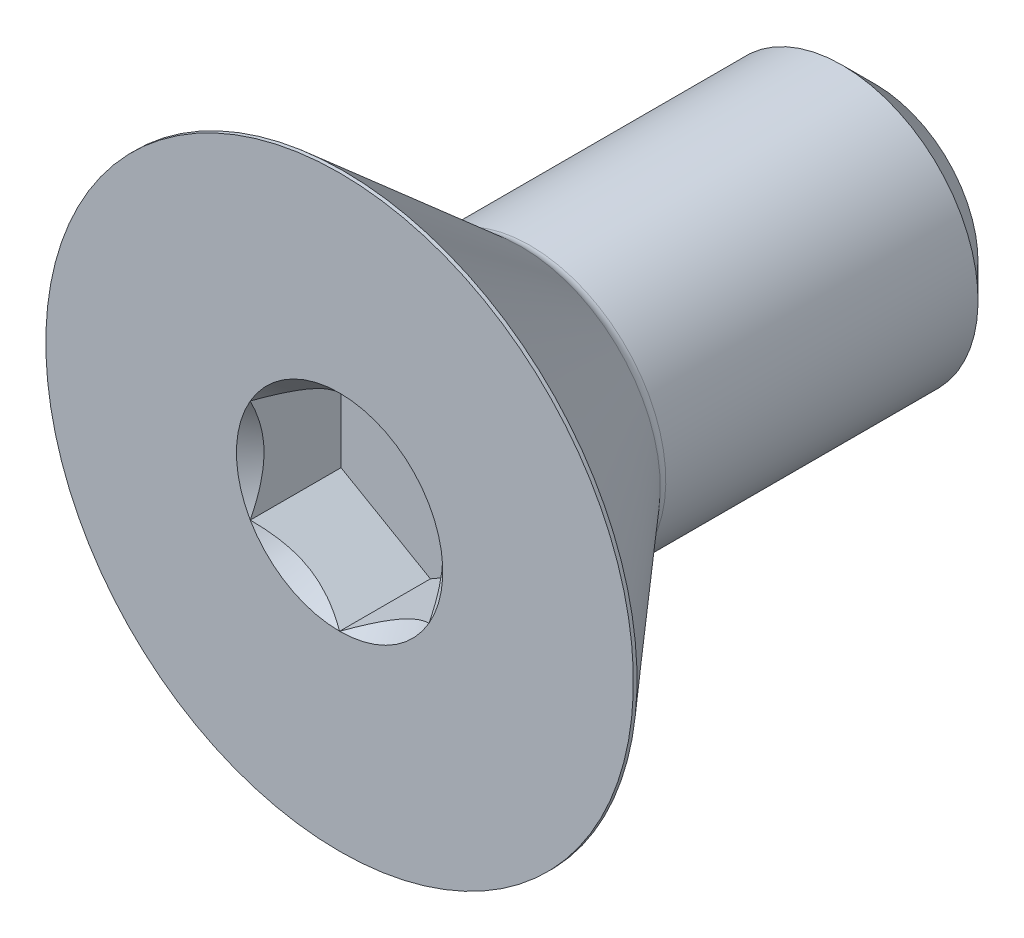
ISO-10303-21;
HEADER;
FILE_DESCRIPTION(('STEP AP214'),'2;1');
FILE_NAME('part.step','',(''),(''),'','','');
FILE_SCHEMA(('AUTOMOTIVE_DESIGN { 1 0 10303 214 1 1 1 1 }'));
ENDSEC;
DATA;
#1=APPLICATION_CONTEXT('core data for automotive mechanical design processes');
#2=APPLICATION_PROTOCOL_DEFINITION('international standard','automotive_design',2000,#1);
#3=PRODUCT_CONTEXT('',#1,'mechanical');
#4=PRODUCT('Part','Part','',(#3));
#5=PRODUCT_RELATED_PRODUCT_CATEGORY('part','',(#4));
#6=PRODUCT_DEFINITION_FORMATION('','',#4);
#7=PRODUCT_DEFINITION_CONTEXT('part definition',#1,'design');
#8=PRODUCT_DEFINITION('design','',#6,#7);
#9=PRODUCT_DEFINITION_SHAPE('','',#8);
#10=(LENGTH_UNIT() NAMED_UNIT(*) SI_UNIT(.MILLI.,.METRE.));
#11=(NAMED_UNIT(*) PLANE_ANGLE_UNIT() SI_UNIT($,.RADIAN.));
#12=(NAMED_UNIT(*) SI_UNIT($,.STERADIAN.) SOLID_ANGLE_UNIT());
#13=UNCERTAINTY_MEASURE_WITH_UNIT(LENGTH_MEASURE(1.E-05),#10,'distance_accuracy_value','');
#14=(GEOMETRIC_REPRESENTATION_CONTEXT(3) GLOBAL_UNCERTAINTY_ASSIGNED_CONTEXT((#13)) GLOBAL_UNIT_ASSIGNED_CONTEXT((#10,
#11,#12)) REPRESENTATION_CONTEXT('',''));
#15=CARTESIAN_POINT('',(0.,0.,0.));
#16=DIRECTION('',(0.,0.,1.));
#17=DIRECTION('',(1.,0.,0.));
#18=AXIS2_PLACEMENT_3D('',#15,#16,#17);
#19=CARTESIAN_POINT('',(0.,0.,4.7625));
#20=DIRECTION('',(0.,0.,1.));
#21=DIRECTION('',(1.,0.,0.));
#22=AXIS2_PLACEMENT_3D('',#19,#20,#21);
#23=CONICAL_SURFACE('',#22,1.83308710467706,0.78539816339745);
#24=CARTESIAN_POINT('',(0.,0.,4.7625));
#25=DIRECTION('',(0.,0.,1.));
#26=DIRECTION('',(1.,0.,0.));
#27=AXIS2_PLACEMENT_3D('',#24,#25,#26);
#28=CIRCLE('',#27,1.83308710467706);
#29=CARTESIAN_POINT('',(0.,-1.83308710467706,4.7625));
#30=VERTEX_POINT('',#29);
#31=CARTESIAN_POINT('',(1.5875,-0.916543552338532,4.7625));
#32=VERTEX_POINT('',#31);
#33=EDGE_CURVE('E236',#30,#32,#28,.T.);
#34=ORIENTED_EDGE('',*,*,#33,.T.);
#35=CARTESIAN_POINT('',(1.5877,-0.916428082284694,4.76261548096371));
#36=CARTESIAN_POINT('',(1.53312479190086,-0.94793709337181,4.7311308083706));
#37=CARTESIAN_POINT('',(1.47763696320971,-0.979973006203396,4.70149504601353));
#38=CARTESIAN_POINT('',(1.36449087915364,-1.04529792829092,4.64723226002083));
#39=CARTESIAN_POINT('',(1.30682185887062,-1.07859315267522,4.62263543513318));
#40=CARTESIAN_POINT('',(1.1905349781269,-1.14573141457583,4.58050036427258));
#41=CARTESIAN_POINT('',(1.13194674474407,-1.17955734689075,4.56285619272982));
#42=CARTESIAN_POINT('',(1.01348022674557,-1.24795402294715,4.53567147008497));
#43=CARTESIAN_POINT('',(0.953605562983895,-1.28252267618759,4.52611062069508));
#44=CARTESIAN_POINT('',(0.850418771876557,-1.34209759781022,4.51748441310401));
#45=CARTESIAN_POINT('',(0.807240015952287,-1.36702686416637,4.51620719280958));
#46=CARTESIAN_POINT('',(0.720953038535398,-1.41684467380557,4.5183570558147));
#47=CARTESIAN_POINT('',(0.677844847078611,-1.44173319974743,4.52178578854934));
#48=CARTESIAN_POINT('',(0.59204633500203,-1.49126899379091,4.53315099443334));
#49=CARTESIAN_POINT('',(0.549356408925406,-1.51591603410293,4.54109137180164));
#50=CARTESIAN_POINT('',(0.464693063478358,-1.56479643938728,4.5610484144511));
#51=CARTESIAN_POINT('',(0.422719959755074,-1.58902962212064,4.57306682920869));
#52=CARTESIAN_POINT('',(0.315211458113566,-1.65109968448354,4.60874689724725));
#53=CARTESIAN_POINT('',(0.2503427717089,-1.68855163804125,4.63509857230314));
#54=CARTESIAN_POINT('',(0.154961599380924,-1.74361998356043,4.6795835368517));
#55=CARTESIAN_POINT('',(0.123530699536157,-1.76176662204668,4.69521285780113));
#56=CARTESIAN_POINT('',(0.0612469855696371,-1.79772614107138,4.7278984878611));
#57=CARTESIAN_POINT('',(0.0303939039605766,-1.8155391760437,4.74495411565697));
#58=CARTESIAN_POINT('',(-0.000200000000000322,-1.8332025747309,4.76261548096371));
#59=B_SPLINE_CURVE_WITH_KNOTS('',3,(#35,#36,#37,#38,#39,#40,#41,#42,#43,#44,#45,#46,#47,#48,#49,
#50,#51,#52,#53,#54,#55,#56,#57,#58),.UNSPECIFIED.,.F.,.F.,(4,2,2,2,2,2,2,2,2,2,2,4),(0.,
0.211482650810817,0.424197870807276,0.633533884524816,0.842342653263348,0.991755553727141,
1.14122083674205,1.29081565918877,1.44047473906438,1.6781878086972,1.79671410024894,
1.91518409436631),.UNSPECIFIED.);
#60=EDGE_CURVE('E11',#32,#30,#59,.T.);
#61=ORIENTED_EDGE('',*,*,#60,.T.);
#62=EDGE_LOOP('',(#34,#61));
#63=FACE_BOUND('',#62,.T.);
#64=ADVANCED_FACE('F38',(#63),#23,.F.);
#65=CARTESIAN_POINT('',(-1.5875,-0.916543552338531,4.7625));
#66=VERTEX_POINT('',#65);
#67=EDGE_CURVE('E241',#66,#30,#28,.T.);
#68=ORIENTED_EDGE('',*,*,#67,.T.);
#69=CARTESIAN_POINT('',(0.000199999999999843,-1.8332025747309,4.76261548096371));
#70=CARTESIAN_POINT('',(-0.0543752080991364,-1.80169356364378,4.7311308083706));
#71=CARTESIAN_POINT('',(-0.10986303679029,-1.7696576508122,4.70149504601353));
#72=CARTESIAN_POINT('',(-0.223009120846359,-1.70433272872467,4.64723226002082));
#73=CARTESIAN_POINT('',(-0.280678141129381,-1.67103750434037,4.62263543513318));
#74=CARTESIAN_POINT('',(-0.396965021873103,-1.60389924243976,4.58050036427258));
#75=CARTESIAN_POINT('',(-0.455553255255931,-1.57007331012484,4.56285619272982));
#76=CARTESIAN_POINT('',(-0.57401977325443,-1.50167663406845,4.53567147008497));
#77=CARTESIAN_POINT('',(-0.633894437016105,-1.46710798082801,4.52611062069508));
#78=CARTESIAN_POINT('',(-0.737081228123442,-1.40753305920537,4.51748441310401));
#79=CARTESIAN_POINT('',(-0.780259984047712,-1.38260379284922,4.51620719280958));
#80=CARTESIAN_POINT('',(-0.866546961464601,-1.33278598321002,4.5183570558147));
#81=CARTESIAN_POINT('',(-0.909655152921387,-1.30789745726817,4.52178578854934));
#82=CARTESIAN_POINT('',(-0.995453664997969,-1.25836166322468,4.53315099443334));
#83=CARTESIAN_POINT('',(-1.03814359107459,-1.23371462291266,4.54109137180164));
#84=CARTESIAN_POINT('',(-1.12280693652164,-1.18483421762831,4.5610484144511));
#85=CARTESIAN_POINT('',(-1.16478004024492,-1.16060103489495,4.57306682920869));
#86=CARTESIAN_POINT('',(-1.27228854188643,-1.09853097253205,4.60874689724725));
#87=CARTESIAN_POINT('',(-1.3371572282911,-1.06107901897434,4.63509857230314));
#88=CARTESIAN_POINT('',(-1.43253840061908,-1.00601067345516,4.6795835368517));
#89=CARTESIAN_POINT('',(-1.46396930046384,-0.987864034968914,4.69521285780113));
#90=CARTESIAN_POINT('',(-1.52625301443036,-0.951904515944214,4.7278984878611));
#91=CARTESIAN_POINT('',(-1.55710609603942,-0.934091480971894,4.74495411565697));
#92=CARTESIAN_POINT('',(-1.5877,-0.916428082284693,4.76261548096371));
#93=B_SPLINE_CURVE_WITH_KNOTS('',3,(#69,#70,#71,#72,#73,#74,#75,#76,#77,#78,#79,#80,#81,#82,#83,
#84,#85,#86,#87,#88,#89,#90,#91,#92),.UNSPECIFIED.,.F.,.F.,(4,2,2,2,2,2,2,2,2,2,2,4),(0.,
0.211482650810817,0.424197870807276,0.633533884524815,0.842342653263348,0.991755553727141,
1.14122083674204,1.29081565918877,1.44047473906437,1.6781878086972,1.79671410024894,
1.91518409436631),.UNSPECIFIED.);
#94=EDGE_CURVE('E52',#30,#66,#93,.T.);
#95=ORIENTED_EDGE('',*,*,#94,.T.);
#96=EDGE_LOOP('',(#68,#95));
#97=FACE_BOUND('',#96,.T.);
#98=ADVANCED_FACE('F227',(#97),#23,.F.);
#99=CARTESIAN_POINT('',(-1.5875,0.916543552338532,4.7625));
#100=VERTEX_POINT('',#99);
#101=EDGE_CURVE('E242',#100,#66,#28,.T.);
#102=ORIENTED_EDGE('',*,*,#101,.T.);
#103=CARTESIAN_POINT('',(-1.5875,-1.84970477544497,5.3669452553756));
#104=CARTESIAN_POINT('',(-1.5875,-1.80476240151239,5.3328462071708));
#105=CARTESIAN_POINT('',(-1.5875,-1.75957199117802,5.29907501989281));
#106=CARTESIAN_POINT('',(-1.5875,-1.66859358881314,5.23232439135481));
#107=CARTESIAN_POINT('',(-1.5875,-1.62280545181692,5.19934514788516));
#108=CARTESIAN_POINT('',(-1.5875,-1.48372199901346,5.10132872516513));
#109=CARTESIAN_POINT('',(-1.5875,-1.38939051274161,5.03773763652916));
#110=CARTESIAN_POINT('',(-1.5875,-1.1914395580246,4.91269987514454));
#111=CARTESIAN_POINT('',(-1.5875,-1.08759987522282,4.85159794240349));
#112=CARTESIAN_POINT('',(-1.5875,-0.874706489386589,4.73968965372726));
#113=CARTESIAN_POINT('',(-1.5875,-0.765671975902254,4.68884856321849));
#114=CARTESIAN_POINT('',(-1.5875,-0.602217292000084,4.62664277390013));
#115=CARTESIAN_POINT('',(-1.5875,-0.550263299202901,4.60882619519952));
#116=CARTESIAN_POINT('',(-1.5875,-0.445082037721644,4.57736151406916));
#117=CARTESIAN_POINT('',(-1.5875,-0.391854683409843,4.56371369282369));
#118=CARTESIAN_POINT('',(-1.5875,-0.285344657080772,4.5415290273729));
#119=CARTESIAN_POINT('',(-1.5875,-0.23208080021017,4.53290327455853));
#120=CARTESIAN_POINT('',(-1.5875,-0.124959456415257,4.52093468251639));
#121=CARTESIAN_POINT('',(-1.5875,-0.071102078467177,4.51759088922275));
#122=CARTESIAN_POINT('',(-1.5875,0.0346213127870738,4.51644382711086));
#123=CARTESIAN_POINT('',(-1.5875,0.0864851538798618,4.51843466080825));
#124=CARTESIAN_POINT('',(-1.5875,0.189778917943216,4.52738765275143));
#125=CARTESIAN_POINT('',(-1.5875,0.241208798942215,4.53435028640556));
#126=CARTESIAN_POINT('',(-1.5875,0.34413338388625,4.5529812853777));
#127=CARTESIAN_POINT('',(-1.5875,0.395613227208263,4.56473049498668));
#128=CARTESIAN_POINT('',(-1.5875,0.497445238808222,4.59230366113255));
#129=CARTESIAN_POINT('',(-1.5875,0.547797493505245,4.60812730423263));
#130=CARTESIAN_POINT('',(-1.5875,0.705347074888855,4.66361764108752));
#131=CARTESIAN_POINT('',(-1.5875,0.810327219424593,4.70956318469654));
#132=CARTESIAN_POINT('',(-1.5875,1.01536433721947,4.81174460760693));
#133=CARTESIAN_POINT('',(-1.5875,1.11540204185221,4.86801726027736));
#134=CARTESIAN_POINT('',(-1.5875,1.30660224236785,4.98414200882669));
#135=CARTESIAN_POINT('',(-1.5875,1.39795887507228,5.04367843332275));
#136=CARTESIAN_POINT('',(-1.5875,1.53255412415747,5.13572821439552));
#137=CARTESIAN_POINT('',(-1.5875,1.57683885315435,5.16673850209615));
#138=CARTESIAN_POINT('',(-1.5875,1.66480239811795,5.22958252247367));
#139=CARTESIAN_POINT('',(-1.5875,1.70848137749646,5.26141602616328));
#140=CARTESIAN_POINT('',(-1.5875,1.75190803967258,5.29359098283441));
#141=B_SPLINE_CURVE_WITH_KNOTS('',3,(#103,#104,#105,#106,#107,#108,#109,#110,#111,#112,#113,
#114,#115,#116,#117,#118,#119,#120,#121,#122,#123,#124,#125,#126,#127,#128,#129,#130,#131,#132,
#133,#134,#135,#136,#137,#138,#139,#140),.UNSPECIFIED.,.F.,.F.,(4,2,2,2,2,2,2,2,2,2,2,2,2,2,2,2,
2,2,4),(0.,0.169238364932428,0.33851856706495,0.679661123808213,1.04081978780735,
1.40073457216113,1.56536778601317,1.73001210198752,1.89164527462954,2.0532492485751,
2.2087065856554,2.36417878970806,2.52239358424591,2.68059621131738,3.0233722729095,
3.36739346781147,3.69436280662923,3.85654464660762,4.01868184900241),.UNSPECIFIED.);
#142=EDGE_CURVE('E201',#66,#100,#141,.T.);
#143=ORIENTED_EDGE('',*,*,#142,.T.);
#144=EDGE_LOOP('',(#102,#143));
#145=FACE_BOUND('',#144,.T.);
#146=ADVANCED_FACE('F232',(#145),#23,.F.);
#147=CARTESIAN_POINT('',(0.,1.83308710467706,4.7625));
#148=VERTEX_POINT('',#147);
#149=EDGE_CURVE('E145',#148,#100,#28,.T.);
#150=ORIENTED_EDGE('',*,*,#149,.T.);
#151=CARTESIAN_POINT('',(-1.5877,0.916428082284694,4.76261548096371));
#152=CARTESIAN_POINT('',(-1.53312479190086,0.94793709337181,4.7311308083706));
#153=CARTESIAN_POINT('',(-1.47763696320971,0.979973006203395,4.70149504601353));
#154=CARTESIAN_POINT('',(-1.36449087915364,1.04529792829092,4.64723226002083));
#155=CARTESIAN_POINT('',(-1.30682185887062,1.07859315267522,4.62263543513318));
#156=CARTESIAN_POINT('',(-1.1905349781269,1.14573141457583,4.58050036427258));
#157=CARTESIAN_POINT('',(-1.13194674474407,1.17955734689075,4.56285619272982));
#158=CARTESIAN_POINT('',(-1.01348022674557,1.24795402294714,4.53567147008497));
#159=CARTESIAN_POINT('',(-0.953605562983895,1.28252267618759,4.52611062069508));
#160=CARTESIAN_POINT('',(-0.850418771876558,1.34209759781022,4.51748441310401));
#161=CARTESIAN_POINT('',(-0.807240015952288,1.36702686416637,4.51620719280958));
#162=CARTESIAN_POINT('',(-0.720953038535399,1.41684467380557,4.5183570558147));
#163=CARTESIAN_POINT('',(-0.677844847078612,1.44173319974742,4.52178578854934));
#164=CARTESIAN_POINT('',(-0.592046335002031,1.49126899379091,4.53315099443334));
#165=CARTESIAN_POINT('',(-0.549356408925407,1.51591603410293,4.54109137180164));
#166=CARTESIAN_POINT('',(-0.464693063478359,1.56479643938728,4.5610484144511));
#167=CARTESIAN_POINT('',(-0.422719959755075,1.58902962212064,4.57306682920869));
#168=CARTESIAN_POINT('',(-0.315211458113567,1.65109968448354,4.60874689724725));
#169=CARTESIAN_POINT('',(-0.2503427717089,1.68855163804125,4.63509857230314));
#170=CARTESIAN_POINT('',(-0.154961599380924,1.74361998356043,4.6795835368517));
#171=CARTESIAN_POINT('',(-0.123530699536157,1.76176662204668,4.69521285780113));
#172=CARTESIAN_POINT('',(-0.061246985569637,1.79772614107138,4.7278984878611));
#173=CARTESIAN_POINT('',(-0.0303939039605765,1.8155391760437,4.74495411565697));
#174=CARTESIAN_POINT('',(0.000200000000000425,1.8332025747309,4.76261548096371));
#175=B_SPLINE_CURVE_WITH_KNOTS('',3,(#151,#152,#153,#154,#155,#156,#157,#158,#159,#160,#161,
#162,#163,#164,#165,#166,#167,#168,#169,#170,#171,#172,#173,#174),.UNSPECIFIED.,.F.,.F.,(4,2,2,
2,2,2,2,2,2,2,2,4),(0.,0.211482650810816,0.424197870807276,0.633533884524815,0.842342653263348,
0.991755553727141,1.14122083674204,1.29081565918877,1.44047473906437,1.6781878086972,
1.79671410024894,1.91518409436631),.UNSPECIFIED.);
#176=EDGE_CURVE('E109',#100,#148,#175,.T.);
#177=ORIENTED_EDGE('',*,*,#176,.T.);
#178=EDGE_LOOP('',(#150,#177));
#179=FACE_BOUND('',#178,.T.);
#180=ADVANCED_FACE('F255',(#179),#23,.F.);
#181=CARTESIAN_POINT('',(1.5875,0.916543552338532,4.7625));
#182=VERTEX_POINT('',#181);
#183=EDGE_CURVE('E141',#182,#148,#28,.T.);
#184=ORIENTED_EDGE('',*,*,#183,.T.);
#185=CARTESIAN_POINT('',(-0.000199999999999648,1.8332025747309,4.76261548096371));
#186=CARTESIAN_POINT('',(0.0543752080991363,1.80169356364378,4.7311308083706));
#187=CARTESIAN_POINT('',(0.10986303679029,1.7696576508122,4.70149504601353));
#188=CARTESIAN_POINT('',(0.223009120846358,1.70433272872468,4.64723226002083));
#189=CARTESIAN_POINT('',(0.280678141129381,1.67103750434037,4.62263543513318));
#190=CARTESIAN_POINT('',(0.396965021873103,1.60389924243976,4.58050036427258));
#191=CARTESIAN_POINT('',(0.455553255255931,1.57007331012484,4.56285619272982));
#192=CARTESIAN_POINT('',(0.57401977325443,1.50167663406845,4.53567147008497));
#193=CARTESIAN_POINT('',(0.633894437016104,1.46710798082801,4.52611062069508));
#194=CARTESIAN_POINT('',(0.737081228123442,1.40753305920537,4.51748441310401));
#195=CARTESIAN_POINT('',(0.780259984047712,1.38260379284922,4.51620719280958));
#196=CARTESIAN_POINT('',(0.866546961464601,1.33278598321002,4.5183570558147));
#197=CARTESIAN_POINT('',(0.909655152921387,1.30789745726817,4.52178578854934));
#198=CARTESIAN_POINT('',(0.995453664997969,1.25836166322469,4.53315099443334));
#199=CARTESIAN_POINT('',(1.03814359107459,1.23371462291266,4.54109137180164));
#200=CARTESIAN_POINT('',(1.12280693652164,1.18483421762831,4.5610484144511));
#201=CARTESIAN_POINT('',(1.16478004024492,1.16060103489495,4.57306682920869));
#202=CARTESIAN_POINT('',(1.27228854188643,1.09853097253205,4.60874689724725));
#203=CARTESIAN_POINT('',(1.3371572282911,1.06107901897434,4.63509857230314));
#204=CARTESIAN_POINT('',(1.43253840061907,1.00601067345516,4.6795835368517));
#205=CARTESIAN_POINT('',(1.46396930046384,0.987864034968915,4.69521285780113));
#206=CARTESIAN_POINT('',(1.52625301443036,0.951904515944215,4.7278984878611));
#207=CARTESIAN_POINT('',(1.55710609603942,0.934091480971895,4.74495411565697));
#208=CARTESIAN_POINT('',(1.5877,0.916428082284694,4.76261548096371));
#209=B_SPLINE_CURVE_WITH_KNOTS('',3,(#185,#186,#187,#188,#189,#190,#191,#192,#193,#194,#195,
#196,#197,#198,#199,#200,#201,#202,#203,#204,#205,#206,#207,#208),.UNSPECIFIED.,.F.,.F.,(4,2,2,
2,2,2,2,2,2,2,2,4),(0.,0.211482650810816,0.424197870807275,0.633533884524814,0.842342653263347,
0.99175555372714,1.14122083674204,1.29081565918877,1.44047473906437,1.6781878086972,
1.79671410024894,1.91518409436631),.UNSPECIFIED.);
#210=EDGE_CURVE('E171',#148,#182,#209,.T.);
#211=ORIENTED_EDGE('',*,*,#210,.T.);
#212=EDGE_LOOP('',(#184,#211));
#213=FACE_BOUND('',#212,.T.);
#214=ADVANCED_FACE('F188',(#213),#23,.F.);
#215=CARTESIAN_POINT('',(0.,0.,-4.7625));
#216=DIRECTION('',(0.,0.,-1.));
#217=DIRECTION('',(0.,1.,0.));
#218=AXIS2_PLACEMENT_3D('',#215,#216,#217);
#219=CYLINDRICAL_SURFACE('',#218,5.2197);
#220=CARTESIAN_POINT('',(0.,0.,4.7625));
#221=DIRECTION('',(0.,0.,-1.));
#222=DIRECTION('',(0.,1.,0.));
#223=AXIS2_PLACEMENT_3D('',#220,#221,#222);
#224=CIRCLE('',#223,5.2197);
#225=CARTESIAN_POINT('',(0.,5.2197,4.7625));
#226=VERTEX_POINT('',#225);
#227=EDGE_CURVE('E160',#226,#226,#224,.T.);
#228=ORIENTED_EDGE('',*,*,#227,.T.);
#229=EDGE_LOOP('',(#228));
#230=FACE_BOUND('',#229,.T.);
#231=CARTESIAN_POINT('',(0.,0.,4.697984));
#232=DIRECTION('',(0.,0.,-1.));
#233=DIRECTION('',(0.,1.,0.));
#234=AXIS2_PLACEMENT_3D('',#231,#232,#233);
#235=CIRCLE('',#234,5.2197);
#236=CARTESIAN_POINT('',(0.,5.2197,4.697984));
#237=VERTEX_POINT('',#236);
#238=EDGE_CURVE('E144',#237,#237,#235,.T.);
#239=ORIENTED_EDGE('',*,*,#238,.F.);
#240=EDGE_LOOP('',(#239));
#241=FACE_BOUND('',#240,.T.);
#242=ADVANCED_FACE('F40',(#230,#241),#219,.T.);
#243=CARTESIAN_POINT('',(0.,0.,4.7625));
#244=DIRECTION('',(0.,0.,1.));
#245=DIRECTION('',(0.,-1.,0.));
#246=AXIS2_PLACEMENT_3D('',#243,#244,#245);
#247=PLANE('',#246);
#248=ORIENTED_EDGE('',*,*,#183,.F.);
#249=EDGE_CURVE('E134',#32,#182,#28,.T.);
#250=ORIENTED_EDGE('',*,*,#249,.F.);
#251=ORIENTED_EDGE('',*,*,#33,.F.);
#252=ORIENTED_EDGE('',*,*,#67,.F.);
#253=ORIENTED_EDGE('',*,*,#101,.F.);
#254=ORIENTED_EDGE('',*,*,#149,.F.);
#255=EDGE_LOOP('',(#248,#250,#251,#252,#253,#254));
#256=FACE_BOUND('',#255,.T.);
#257=ORIENTED_EDGE('',*,*,#227,.F.);
#258=EDGE_LOOP('',(#257));
#259=FACE_BOUND('',#258,.T.);
#260=ADVANCED_FACE('F246',(#256,#259),#247,.T.);
#261=CARTESIAN_POINT('',(0.,1.8176875,-4.7625));
#262=DIRECTION('',(0.,0.,-1.));
#263=DIRECTION('',(0.,1.,0.));
#264=AXIS2_PLACEMENT_3D('',#261,#262,#263);
#265=PLANE('',#264);
#266=CARTESIAN_POINT('',(0.,0.,-4.7625));
#267=DIRECTION('',(0.,0.,-1.));
#268=DIRECTION('',(0.,1.,0.));
#269=AXIS2_PLACEMENT_3D('',#266,#267,#268);
#270=CIRCLE('',#269,1.8176875);
#271=CARTESIAN_POINT('',(0.,1.8176875,-4.7625));
#272=VERTEX_POINT('',#271);
#273=EDGE_CURVE('E157',#272,#272,#270,.T.);
#274=ORIENTED_EDGE('',*,*,#273,.T.);
#275=EDGE_LOOP('',(#274));
#276=FACE_BOUND('',#275,.T.);
#277=ADVANCED_FACE('F310',(#276),#265,.T.);
#278=CARTESIAN_POINT('',(0.,0.,-4.7625));
#279=DIRECTION('',(0.,0.,1.));
#280=DIRECTION('',(0.,-1.,0.));
#281=AXIS2_PLACEMENT_3D('',#278,#279,#280);
#282=CONICAL_SURFACE('',#281,1.8176875,0.785398163397452);
#283=CARTESIAN_POINT('',(0.,0.,-4.1671875));
#284=DIRECTION('',(0.,0.,-1.));
#285=DIRECTION('',(0.,1.,0.));
#286=AXIS2_PLACEMENT_3D('',#283,#284,#285);
#287=CIRCLE('',#286,2.413);
#288=CARTESIAN_POINT('',(0.,2.413,-4.1671875));
#289=VERTEX_POINT('',#288);
#290=EDGE_CURVE('E154',#289,#289,#287,.T.);
#291=ORIENTED_EDGE('',*,*,#290,.T.);
#292=EDGE_LOOP('',(#291));
#293=FACE_BOUND('',#292,.T.);
#294=ORIENTED_EDGE('',*,*,#273,.F.);
#295=EDGE_LOOP('',(#294));
#296=FACE_BOUND('',#295,.T.);
#297=ADVANCED_FACE('F300',(#293,#296),#282,.T.);
#298=CARTESIAN_POINT('',(0.,0.,-4.7625));
#299=DIRECTION('',(0.,0.,-1.));
#300=DIRECTION('',(0.,1.,0.));
#301=AXIS2_PLACEMENT_3D('',#298,#299,#300);
#302=CYLINDRICAL_SURFACE('',#301,2.413);
#303=CARTESIAN_POINT('',(0.,0.,1.37986622866131));
#304=DIRECTION('',(0.,0.,-1.));
#305=DIRECTION('',(0.,1.,0.));
#306=AXIS2_PLACEMENT_3D('',#303,#304,#305);
#307=CIRCLE('',#306,2.413);
#308=CARTESIAN_POINT('',(0.,2.413,1.37986622866131));
#309=VERTEX_POINT('',#308);
#310=EDGE_CURVE('E151',#309,#309,#307,.T.);
#311=ORIENTED_EDGE('',*,*,#310,.T.);
#312=EDGE_LOOP('',(#311));
#313=FACE_BOUND('',#312,.T.);
#314=ORIENTED_EDGE('',*,*,#290,.F.);
#315=EDGE_LOOP('',(#314));
#316=FACE_BOUND('',#315,.T.);
#317=ADVANCED_FACE('F291',(#313,#316),#302,.T.);
#318=CARTESIAN_POINT('',(0.,0.,1.37986622866131));
#319=DIRECTION('',(0.,0.,-1.));
#320=DIRECTION('',(0.,1.,0.));
#321=AXIS2_PLACEMENT_3D('',#318,#319,#320);
#322=TOROIDAL_SURFACE('',#321,2.65205436006271,0.23905436006271);
#323=CARTESIAN_POINT('',(0.,0.,1.5367));
#324=DIRECTION('',(0.,0.,-1.));
#325=DIRECTION('',(0.,1.,0.));
#326=AXIS2_PLACEMENT_3D('',#323,#324,#325);
#327=CIRCLE('',#326,2.47163774432936);
#328=CARTESIAN_POINT('',(0.,2.47163774432936,1.5367));
#329=VERTEX_POINT('',#328);
#330=EDGE_CURVE('E148',#329,#329,#327,.T.);
#331=ORIENTED_EDGE('',*,*,#330,.T.);
#332=EDGE_LOOP('',(#331));
#333=FACE_BOUND('',#332,.T.);
#334=ORIENTED_EDGE('',*,*,#310,.F.);
#335=EDGE_LOOP('',(#334));
#336=FACE_BOUND('',#335,.T.);
#337=ADVANCED_FACE('F281',(#333,#336),#322,.F.);
#338=CARTESIAN_POINT('',(0.,0.,1.5367));
#339=DIRECTION('',(0.,0.,1.));
#340=DIRECTION('',(0.,-1.,0.));
#341=AXIS2_PLACEMENT_3D('',#338,#339,#340);
#342=CONICAL_SURFACE('',#341,2.47163774432936,0.715584993317677);
#343=ORIENTED_EDGE('',*,*,#238,.T.);
#344=EDGE_LOOP('',(#343));
#345=FACE_BOUND('',#344,.T.);
#346=ORIENTED_EDGE('',*,*,#330,.F.);
#347=EDGE_LOOP('',(#346));
#348=FACE_BOUND('',#347,.T.);
#349=ADVANCED_FACE('F186',(#345,#348),#342,.T.);
#350=ORIENTED_EDGE('',*,*,#249,.T.);
#351=CARTESIAN_POINT('',(1.5875,-1.84970477544497,5.3669452553756));
#352=CARTESIAN_POINT('',(1.5875,-1.80476240151239,5.3328462071708));
#353=CARTESIAN_POINT('',(1.5875,-1.75957199117802,5.29907501989281));
#354=CARTESIAN_POINT('',(1.5875,-1.66859358881314,5.23232439135481));
#355=CARTESIAN_POINT('',(1.5875,-1.62280545181692,5.19934514788516));
#356=CARTESIAN_POINT('',(1.5875,-1.48372199901346,5.10132872516513));
#357=CARTESIAN_POINT('',(1.5875,-1.38939051274161,5.03773763652916));
#358=CARTESIAN_POINT('',(1.5875,-1.1914395580246,4.91269987514454));
#359=CARTESIAN_POINT('',(1.5875,-1.08759987522283,4.85159794240349));
#360=CARTESIAN_POINT('',(1.5875,-0.874706489386589,4.73968965372726));
#361=CARTESIAN_POINT('',(1.5875,-0.765671975902255,4.68884856321849));
#362=CARTESIAN_POINT('',(1.5875,-0.602217292000084,4.62664277390013));
#363=CARTESIAN_POINT('',(1.5875,-0.550263299202902,4.60882619519952));
#364=CARTESIAN_POINT('',(1.5875,-0.445082037721645,4.57736151406916));
#365=CARTESIAN_POINT('',(1.5875,-0.391854683409844,4.56371369282369));
#366=CARTESIAN_POINT('',(1.5875,-0.285344657080773,4.5415290273729));
#367=CARTESIAN_POINT('',(1.5875,-0.23208080021017,4.53290327455853));
#368=CARTESIAN_POINT('',(1.5875,-0.124959456415258,4.52093468251639));
#369=CARTESIAN_POINT('',(1.5875,-0.0711020784671775,4.51759088922275));
#370=CARTESIAN_POINT('',(1.5875,0.0346213127870734,4.51644382711086));
#371=CARTESIAN_POINT('',(1.5875,0.0864851538798614,4.51843466080825));
#372=CARTESIAN_POINT('',(1.5875,0.189778917943216,4.52738765275143));
#373=CARTESIAN_POINT('',(1.5875,0.241208798942215,4.53435028640556));
#374=CARTESIAN_POINT('',(1.5875,0.34413338388625,4.5529812853777));
#375=CARTESIAN_POINT('',(1.5875,0.395613227208263,4.56473049498668));
#376=CARTESIAN_POINT('',(1.5875,0.497445238808222,4.59230366113255));
#377=CARTESIAN_POINT('',(1.5875,0.547797493505245,4.60812730423263));
#378=CARTESIAN_POINT('',(1.5875,0.705347074888854,4.66361764108752));
#379=CARTESIAN_POINT('',(1.5875,0.810327219424593,4.70956318469654));
#380=CARTESIAN_POINT('',(1.5875,1.01536433721947,4.81174460760693));
#381=CARTESIAN_POINT('',(1.5875,1.11540204185221,4.86801726027735));
#382=CARTESIAN_POINT('',(1.5875,1.30660224236785,4.98414200882669));
#383=CARTESIAN_POINT('',(1.5875,1.39795887507228,5.04367843332275));
#384=CARTESIAN_POINT('',(1.5875,1.53255412415747,5.13572821439552));
#385=CARTESIAN_POINT('',(1.5875,1.57683885315435,5.16673850209615));
#386=CARTESIAN_POINT('',(1.5875,1.66480239811795,5.22958252247366));
#387=CARTESIAN_POINT('',(1.5875,1.70848137749646,5.26141602616328));
#388=CARTESIAN_POINT('',(1.5875,1.75190803967258,5.29359098283441));
#389=B_SPLINE_CURVE_WITH_KNOTS('',3,(#351,#352,#353,#354,#355,#356,#357,#358,#359,#360,#361,
#362,#363,#364,#365,#366,#367,#368,#369,#370,#371,#372,#373,#374,#375,#376,#377,#378,#379,#380,
#381,#382,#383,#384,#385,#386,#387,#388),.UNSPECIFIED.,.F.,.F.,(4,2,2,2,2,2,2,2,2,2,2,2,2,2,2,2,
2,2,4),(0.,0.16923836493243,0.338518567064952,0.679661123808214,1.04081978780735,
1.40073457216113,1.56536778601317,1.73001210198752,1.89164527462955,2.0532492485751,
2.2087065856554,2.36417878970806,2.52239358424591,2.68059621131738,3.0233722729095,
3.36739346781147,3.69436280662923,3.85654464660762,4.01868184900241),.UNSPECIFIED.);
#390=EDGE_CURVE('E163',#182,#32,#389,.F.);
#391=ORIENTED_EDGE('',*,*,#390,.T.);
#392=EDGE_LOOP('',(#350,#391));
#393=FACE_BOUND('',#392,.T.);
#394=ADVANCED_FACE('F180',(#393),#23,.F.);
#395=CARTESIAN_POINT('',(0.,-1.83308710467706,3.1496));
#396=DIRECTION('',(0.5,-0.866025403784439,0.));
#397=DIRECTION('',(0.866025403784439,0.5,0.));
#398=AXIS2_PLACEMENT_3D('',#395,#396,#397);
#399=PLANE('',#398);
#400=DIRECTION('',(0.,0.,1.));
#401=VECTOR('',#400,1.);
#402=CARTESIAN_POINT('',(1.5875,-0.916543552338532,3.1496));
#403=LINE('',#402,#401);
#404=CARTESIAN_POINT('',(1.5875,-0.916543552338532,3.1496));
#405=VERTEX_POINT('',#404);
#406=EDGE_CURVE('E59',#405,#32,#403,.T.);
#407=ORIENTED_EDGE('',*,*,#406,.F.);
#408=DIRECTION('',(0.866025403784439,0.5,0.));
#409=VECTOR('',#408,1.);
#410=CARTESIAN_POINT('',(0.,-1.83308710467706,3.1496));
#411=LINE('',#410,#409);
#412=CARTESIAN_POINT('',(0.,-1.83308710467706,3.1496));
#413=VERTEX_POINT('',#412);
#414=EDGE_CURVE('E412',#413,#405,#411,.T.);
#415=ORIENTED_EDGE('',*,*,#414,.F.);
#416=DIRECTION('',(0.,0.,1.));
#417=VECTOR('',#416,1.);
#418=CARTESIAN_POINT('',(0.,-1.83308710467706,3.1496));
#419=LINE('',#418,#417);
#420=EDGE_CURVE('E68',#413,#30,#419,.T.);
#421=ORIENTED_EDGE('',*,*,#420,.T.);
#422=ORIENTED_EDGE('',*,*,#60,.F.);
#423=EDGE_LOOP('',(#407,#415,#421,#422));
#424=FACE_BOUND('',#423,.T.);
#425=ADVANCED_FACE('F185',(#424),#399,.F.);
#426=CARTESIAN_POINT('',(-1.5875,-0.916543552338531,3.1496));
#427=DIRECTION('',(-0.5,-0.866025403784438,0.));
#428=DIRECTION('',(0.866025403784439,-0.5,0.));
#429=AXIS2_PLACEMENT_3D('',#426,#427,#428);
#430=PLANE('',#429);
#431=ORIENTED_EDGE('',*,*,#420,.F.);
#432=DIRECTION('',(0.866025403784438,-0.5,0.));
#433=VECTOR('',#432,1.);
#434=CARTESIAN_POINT('',(-1.5875,-0.916543552338531,3.1496));
#435=LINE('',#434,#433);
#436=CARTESIAN_POINT('',(-1.5875,-0.916543552338531,3.1496));
#437=VERTEX_POINT('',#436);
#438=EDGE_CURVE('E120',#437,#413,#435,.T.);
#439=ORIENTED_EDGE('',*,*,#438,.F.);
#440=DIRECTION('',(0.,0.,1.));
#441=VECTOR('',#440,1.);
#442=CARTESIAN_POINT('',(-1.5875,-0.916543552338531,3.1496));
#443=LINE('',#442,#441);
#444=EDGE_CURVE('E112',#437,#66,#443,.T.);
#445=ORIENTED_EDGE('',*,*,#444,.T.);
#446=ORIENTED_EDGE('',*,*,#94,.F.);
#447=EDGE_LOOP('',(#431,#439,#445,#446));
#448=FACE_BOUND('',#447,.T.);
#449=ADVANCED_FACE('F212',(#448),#430,.F.);
#450=CARTESIAN_POINT('',(-1.5875,0.916543552338532,3.1496));
#451=DIRECTION('',(-1.,0.,0.));
#452=DIRECTION('',(0.,0.,1.));
#453=AXIS2_PLACEMENT_3D('',#450,#451,#452);
#454=PLANE('',#453);
#455=ORIENTED_EDGE('',*,*,#444,.F.);
#456=DIRECTION('',(0.,-1.,0.));
#457=VECTOR('',#456,1.);
#458=CARTESIAN_POINT('',(-1.5875,0.916543552338532,3.1496));
#459=LINE('',#458,#457);
#460=CARTESIAN_POINT('',(-1.5875,0.916543552338532,3.1496));
#461=VERTEX_POINT('',#460);
#462=EDGE_CURVE('E116',#461,#437,#459,.T.);
#463=ORIENTED_EDGE('',*,*,#462,.F.);
#464=DIRECTION('',(0.,0.,1.));
#465=VECTOR('',#464,1.);
#466=CARTESIAN_POINT('',(-1.5875,0.916543552338532,3.1496));
#467=LINE('',#466,#465);
#468=EDGE_CURVE('E101',#461,#100,#467,.T.);
#469=ORIENTED_EDGE('',*,*,#468,.T.);
#470=ORIENTED_EDGE('',*,*,#142,.F.);
#471=EDGE_LOOP('',(#455,#463,#469,#470));
#472=FACE_BOUND('',#471,.T.);
#473=ADVANCED_FACE('F117',(#472),#454,.F.);
#474=CARTESIAN_POINT('',(0.,1.83308710467706,3.1496));
#475=DIRECTION('',(-0.5,0.866025403784439,0.));
#476=DIRECTION('',(-0.866025403784439,-0.5,0.));
#477=AXIS2_PLACEMENT_3D('',#474,#475,#476);
#478=PLANE('',#477);
#479=ORIENTED_EDGE('',*,*,#468,.F.);
#480=DIRECTION('',(-0.866025403784439,-0.5,0.));
#481=VECTOR('',#480,1.);
#482=CARTESIAN_POINT('',(0.,1.83308710467706,3.1496));
#483=LINE('',#482,#481);
#484=CARTESIAN_POINT('',(0.,1.83308710467706,3.1496));
#485=VERTEX_POINT('',#484);
#486=EDGE_CURVE('E106',#485,#461,#483,.T.);
#487=ORIENTED_EDGE('',*,*,#486,.F.);
#488=DIRECTION('',(0.,0.,1.));
#489=VECTOR('',#488,1.);
#490=CARTESIAN_POINT('',(0.,1.83308710467706,3.1496));
#491=LINE('',#490,#489);
#492=EDGE_CURVE('E113',#485,#148,#491,.T.);
#493=ORIENTED_EDGE('',*,*,#492,.T.);
#494=ORIENTED_EDGE('',*,*,#176,.F.);
#495=EDGE_LOOP('',(#479,#487,#493,#494));
#496=FACE_BOUND('',#495,.T.);
#497=ADVANCED_FACE('F103',(#496),#478,.F.);
#498=CARTESIAN_POINT('',(1.5875,0.916543552338532,3.1496));
#499=DIRECTION('',(0.5,0.866025403784439,0.));
#500=DIRECTION('',(-0.866025403784439,0.5,0.));
#501=AXIS2_PLACEMENT_3D('',#498,#499,#500);
#502=PLANE('',#501);
#503=ORIENTED_EDGE('',*,*,#492,.F.);
#504=DIRECTION('',(-0.866025403784439,0.5,0.));
#505=VECTOR('',#504,1.);
#506=CARTESIAN_POINT('',(1.5875,0.916543552338532,3.1496));
#507=LINE('',#506,#505);
#508=CARTESIAN_POINT('',(1.5875,0.916543552338532,3.1496));
#509=VERTEX_POINT('',#508);
#510=EDGE_CURVE('E126',#509,#485,#507,.T.);
#511=ORIENTED_EDGE('',*,*,#510,.F.);
#512=DIRECTION('',(0.,0.,1.));
#513=VECTOR('',#512,1.);
#514=CARTESIAN_POINT('',(1.5875,0.916543552338532,3.1496));
#515=LINE('',#514,#513);
#516=EDGE_CURVE('E137',#509,#182,#515,.T.);
#517=ORIENTED_EDGE('',*,*,#516,.T.);
#518=ORIENTED_EDGE('',*,*,#210,.F.);
#519=EDGE_LOOP('',(#503,#511,#517,#518));
#520=FACE_BOUND('',#519,.T.);
#521=ADVANCED_FACE('F219',(#520),#502,.F.);
#522=CARTESIAN_POINT('',(1.5875,-0.916543552338532,3.1496));
#523=DIRECTION('',(1.,0.,0.));
#524=DIRECTION('',(0.,1.,0.));
#525=AXIS2_PLACEMENT_3D('',#522,#523,#524);
#526=PLANE('',#525);
#527=ORIENTED_EDGE('',*,*,#516,.F.);
#528=DIRECTION('',(0.,1.,0.));
#529=VECTOR('',#528,1.);
#530=CARTESIAN_POINT('',(1.5875,-0.916543552338532,3.1496));
#531=LINE('',#530,#529);
#532=EDGE_CURVE('E128',#405,#509,#531,.T.);
#533=ORIENTED_EDGE('',*,*,#532,.F.);
#534=ORIENTED_EDGE('',*,*,#406,.T.);
#535=ORIENTED_EDGE('',*,*,#390,.F.);
#536=EDGE_LOOP('',(#527,#533,#534,#535));
#537=FACE_BOUND('',#536,.T.);
#538=ADVANCED_FACE('F178',(#537),#526,.F.);
#539=CARTESIAN_POINT('',(0.,0.,3.1496));
#540=DIRECTION('',(0.,0.,1.));
#541=DIRECTION('',(1.,0.,0.));
#542=AXIS2_PLACEMENT_3D('',#539,#540,#541);
#543=PLANE('',#542);
#544=ORIENTED_EDGE('',*,*,#414,.T.);
#545=ORIENTED_EDGE('',*,*,#532,.T.);
#546=ORIENTED_EDGE('',*,*,#510,.T.);
#547=ORIENTED_EDGE('',*,*,#486,.T.);
#548=ORIENTED_EDGE('',*,*,#462,.T.);
#549=ORIENTED_EDGE('',*,*,#438,.T.);
#550=EDGE_LOOP('',(#544,#545,#546,#547,#548,#549));
#551=FACE_BOUND('',#550,.T.);
#552=ADVANCED_FACE('F123',(#551),#543,.T.);
#553=CLOSED_SHELL('',(#64,#98,#146,#180,#214,#242,#260,#277,#297,#317,#337,#349,#394,#425,#449,
#473,#497,#521,#538,#552));
#554=MANIFOLD_SOLID_BREP('B2',#553);
#555=ADVANCED_BREP_SHAPE_REPRESENTATION('',(#18,#554),#14);
#556=SHAPE_DEFINITION_REPRESENTATION(#9,#555);
ENDSEC;
END-ISO-10303-21;
